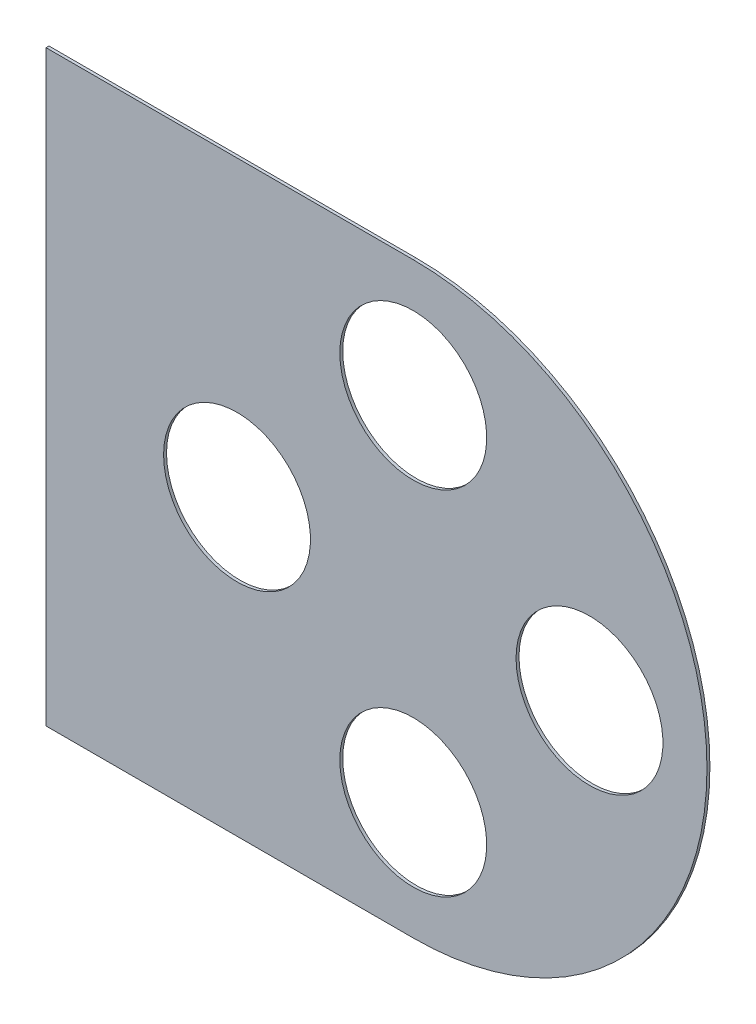
ISO-10303-21;
HEADER;
FILE_DESCRIPTION(('STEP AP214'),'2;1');
FILE_NAME('part.step','',(''),(''),'','','');
FILE_SCHEMA(('AUTOMOTIVE_DESIGN { 1 0 10303 214 1 1 1 1 }'));
ENDSEC;
DATA;
#1=APPLICATION_CONTEXT('core data for automotive mechanical design processes');
#2=APPLICATION_PROTOCOL_DEFINITION('international standard','automotive_design',2000,#1);
#3=PRODUCT_CONTEXT('',#1,'mechanical');
#4=PRODUCT('Part','Part','',(#3));
#5=PRODUCT_RELATED_PRODUCT_CATEGORY('part','',(#4));
#6=PRODUCT_DEFINITION_FORMATION('','',#4);
#7=PRODUCT_DEFINITION_CONTEXT('part definition',#1,'design');
#8=PRODUCT_DEFINITION('design','',#6,#7);
#9=PRODUCT_DEFINITION_SHAPE('','',#8);
#10=(LENGTH_UNIT() NAMED_UNIT(*) SI_UNIT(.MILLI.,.METRE.));
#11=(NAMED_UNIT(*) PLANE_ANGLE_UNIT() SI_UNIT($,.RADIAN.));
#12=(NAMED_UNIT(*) SI_UNIT($,.STERADIAN.) SOLID_ANGLE_UNIT());
#13=UNCERTAINTY_MEASURE_WITH_UNIT(LENGTH_MEASURE(1.E-05),#10,'distance_accuracy_value','');
#14=(GEOMETRIC_REPRESENTATION_CONTEXT(3) GLOBAL_UNCERTAINTY_ASSIGNED_CONTEXT((#13)) GLOBAL_UNIT_ASSIGNED_CONTEXT((#10,
#11,#12)) REPRESENTATION_CONTEXT('',''));
#15=CARTESIAN_POINT('',(0.,0.,0.));
#16=DIRECTION('',(0.,0.,1.));
#17=DIRECTION('',(1.,0.,0.));
#18=AXIS2_PLACEMENT_3D('',#15,#16,#17);
#19=CARTESIAN_POINT('',(-12.5,-10.,14.));
#20=DIRECTION('',(-1.,0.,0.));
#21=DIRECTION('',(0.,1.,0.));
#22=AXIS2_PLACEMENT_3D('',#19,#20,#21);
#23=PLANE('',#22);
#24=DIRECTION('',(0.,0.,-1.));
#25=VECTOR('',#24,1.);
#26=CARTESIAN_POINT('',(-12.5,-10.,14.));
#27=LINE('',#26,#25);
#28=CARTESIAN_POINT('',(-12.5,-10.,14.1));
#29=VERTEX_POINT('',#28);
#30=CARTESIAN_POINT('',(-12.5,-10.,14.));
#31=VERTEX_POINT('',#30);
#32=EDGE_CURVE('E11',#29,#31,#27,.T.);
#33=ORIENTED_EDGE('',*,*,#32,.F.);
#34=DIRECTION('',(0.,1.,0.));
#35=VECTOR('',#34,1.);
#36=CARTESIAN_POINT('',(-12.5,-10.,14.1));
#37=LINE('',#36,#35);
#38=CARTESIAN_POINT('',(-12.5,10.,14.1));
#39=VERTEX_POINT('',#38);
#40=EDGE_CURVE('E94',#29,#39,#37,.T.);
#41=ORIENTED_EDGE('',*,*,#40,.T.);
#42=DIRECTION('',(0.,0.,-1.));
#43=VECTOR('',#42,1.);
#44=CARTESIAN_POINT('',(-12.5,10.,14.));
#45=LINE('',#44,#43);
#46=CARTESIAN_POINT('',(-12.5,10.,14.));
#47=VERTEX_POINT('',#46);
#48=EDGE_CURVE('E47',#39,#47,#45,.T.);
#49=ORIENTED_EDGE('',*,*,#48,.T.);
#50=DIRECTION('',(0.,1.,0.));
#51=VECTOR('',#50,1.);
#52=CARTESIAN_POINT('',(-12.5,-10.,14.));
#53=LINE('',#52,#51);
#54=EDGE_CURVE('E119',#31,#47,#53,.T.);
#55=ORIENTED_EDGE('',*,*,#54,.F.);
#56=EDGE_LOOP('',(#33,#41,#49,#55));
#57=FACE_BOUND('',#56,.T.);
#58=ADVANCED_FACE('F37',(#57),#23,.T.);
#59=CARTESIAN_POINT('',(11.,10.,14.));
#60=DIRECTION('',(0.,-1.,0.));
#61=DIRECTION('',(-1.,0.,0.));
#62=AXIS2_PLACEMENT_3D('',#59,#60,#61);
#63=PLANE('',#62);
#64=ORIENTED_EDGE('',*,*,#48,.F.);
#65=DIRECTION('',(-1.,0.,0.));
#66=VECTOR('',#65,1.);
#67=CARTESIAN_POINT('',(11.,10.,14.1));
#68=LINE('',#67,#66);
#69=CARTESIAN_POINT('',(0.,10.,14.1));
#70=VERTEX_POINT('',#69);
#71=EDGE_CURVE('E101',#70,#39,#68,.T.);
#72=ORIENTED_EDGE('',*,*,#71,.F.);
#73=DIRECTION('',(0.,0.,-1.));
#74=VECTOR('',#73,1.);
#75=CARTESIAN_POINT('',(0.,10.,14.));
#76=LINE('',#75,#74);
#77=CARTESIAN_POINT('',(0.,10.,14.));
#78=VERTEX_POINT('',#77);
#79=EDGE_CURVE('E55',#70,#78,#76,.T.);
#80=ORIENTED_EDGE('',*,*,#79,.T.);
#81=DIRECTION('',(-1.,0.,0.));
#82=VECTOR('',#81,1.);
#83=CARTESIAN_POINT('',(11.,10.,14.));
#84=LINE('',#83,#82);
#85=EDGE_CURVE('E124',#78,#47,#84,.T.);
#86=ORIENTED_EDGE('',*,*,#85,.T.);
#87=EDGE_LOOP('',(#64,#72,#80,#86));
#88=FACE_BOUND('',#87,.T.);
#89=ADVANCED_FACE('F126',(#88),#63,.F.);
#90=CARTESIAN_POINT('',(0.,0.,14.));
#91=DIRECTION('',(0.,0.,-1.));
#92=DIRECTION('',(-1.,0.,0.));
#93=AXIS2_PLACEMENT_3D('',#90,#91,#92);
#94=CYLINDRICAL_SURFACE('',#93,10.);
#95=ORIENTED_EDGE('',*,*,#79,.F.);
#96=CARTESIAN_POINT('',(0.,0.,14.1));
#97=DIRECTION('',(0.,0.,-1.));
#98=DIRECTION('',(-1.,0.,0.));
#99=AXIS2_PLACEMENT_3D('',#96,#97,#98);
#100=CIRCLE('',#99,10.);
#101=CARTESIAN_POINT('',(0.,-10.,14.1));
#102=VERTEX_POINT('',#101);
#103=EDGE_CURVE('E93',#102,#70,#100,.F.);
#104=ORIENTED_EDGE('',*,*,#103,.F.);
#105=DIRECTION('',(0.,0.,-1.));
#106=VECTOR('',#105,1.);
#107=CARTESIAN_POINT('',(0.,-10.,14.));
#108=LINE('',#107,#106);
#109=CARTESIAN_POINT('',(0.,-10.,14.));
#110=VERTEX_POINT('',#109);
#111=EDGE_CURVE('E41',#102,#110,#108,.T.);
#112=ORIENTED_EDGE('',*,*,#111,.T.);
#113=CARTESIAN_POINT('',(0.,0.,14.));
#114=DIRECTION('',(0.,0.,-1.));
#115=DIRECTION('',(-1.,0.,0.));
#116=AXIS2_PLACEMENT_3D('',#113,#114,#115);
#117=CIRCLE('',#116,10.);
#118=EDGE_CURVE('E116',#110,#78,#117,.F.);
#119=ORIENTED_EDGE('',*,*,#118,.T.);
#120=EDGE_LOOP('',(#95,#104,#112,#119));
#121=FACE_BOUND('',#120,.T.);
#122=ADVANCED_FACE('F96',(#121),#94,.T.);
#123=CARTESIAN_POINT('',(11.,-10.,14.));
#124=DIRECTION('',(0.,-1.,0.));
#125=DIRECTION('',(-1.,0.,0.));
#126=AXIS2_PLACEMENT_3D('',#123,#124,#125);
#127=PLANE('',#126);
#128=DIRECTION('',(-1.,0.,0.));
#129=VECTOR('',#128,1.);
#130=CARTESIAN_POINT('',(11.,-10.,14.1));
#131=LINE('',#130,#129);
#132=EDGE_CURVE('E81',#102,#29,#131,.T.);
#133=ORIENTED_EDGE('',*,*,#132,.T.);
#134=ORIENTED_EDGE('',*,*,#32,.T.);
#135=DIRECTION('',(-1.,0.,0.));
#136=VECTOR('',#135,1.);
#137=CARTESIAN_POINT('',(11.,-10.,14.));
#138=LINE('',#137,#136);
#139=EDGE_CURVE('E83',#110,#31,#138,.T.);
#140=ORIENTED_EDGE('',*,*,#139,.F.);
#141=ORIENTED_EDGE('',*,*,#111,.F.);
#142=EDGE_LOOP('',(#133,#134,#140,#141));
#143=FACE_BOUND('',#142,.T.);
#144=ADVANCED_FACE('F80',(#143),#127,.T.);
#145=CARTESIAN_POINT('',(6.,0.,14.));
#146=DIRECTION('',(0.,0.,-1.));
#147=DIRECTION('',(-1.,0.,0.));
#148=AXIS2_PLACEMENT_3D('',#145,#146,#147);
#149=CYLINDRICAL_SURFACE('',#148,2.5);
#150=CARTESIAN_POINT('',(6.,0.,14.));
#151=DIRECTION('',(0.,0.,-1.));
#152=DIRECTION('',(-1.,0.,0.));
#153=AXIS2_PLACEMENT_3D('',#150,#151,#152);
#154=CIRCLE('',#153,2.5);
#155=CARTESIAN_POINT('',(3.5,0.,14.));
#156=VERTEX_POINT('',#155);
#157=EDGE_CURVE('E127',#156,#156,#154,.T.);
#158=ORIENTED_EDGE('',*,*,#157,.T.);
#159=EDGE_LOOP('',(#158));
#160=FACE_BOUND('',#159,.T.);
#161=CARTESIAN_POINT('',(6.,0.,14.1));
#162=DIRECTION('',(0.,0.,-1.));
#163=DIRECTION('',(-1.,0.,0.));
#164=AXIS2_PLACEMENT_3D('',#161,#162,#163);
#165=CIRCLE('',#164,2.5);
#166=CARTESIAN_POINT('',(3.5,0.,14.1));
#167=VERTEX_POINT('',#166);
#168=EDGE_CURVE('E103',#167,#167,#165,.T.);
#169=ORIENTED_EDGE('',*,*,#168,.F.);
#170=EDGE_LOOP('',(#169));
#171=FACE_BOUND('',#170,.T.);
#172=ADVANCED_FACE('F163',(#160,#171),#149,.F.);
#173=CARTESIAN_POINT('',(0.,-6.,14.));
#174=DIRECTION('',(0.,0.,-1.));
#175=DIRECTION('',(-1.,0.,0.));
#176=AXIS2_PLACEMENT_3D('',#173,#174,#175);
#177=CYLINDRICAL_SURFACE('',#176,2.5);
#178=CARTESIAN_POINT('',(0.,-6.,14.));
#179=DIRECTION('',(0.,0.,-1.));
#180=DIRECTION('',(-1.,0.,0.));
#181=AXIS2_PLACEMENT_3D('',#178,#179,#180);
#182=CIRCLE('',#181,2.5);
#183=CARTESIAN_POINT('',(-2.5,-6.,14.));
#184=VERTEX_POINT('',#183);
#185=EDGE_CURVE('E130',#184,#184,#182,.T.);
#186=ORIENTED_EDGE('',*,*,#185,.T.);
#187=EDGE_LOOP('',(#186));
#188=FACE_BOUND('',#187,.T.);
#189=CARTESIAN_POINT('',(0.,-6.,14.1));
#190=DIRECTION('',(0.,0.,-1.));
#191=DIRECTION('',(-1.,0.,0.));
#192=AXIS2_PLACEMENT_3D('',#189,#190,#191);
#193=CIRCLE('',#192,2.5);
#194=CARTESIAN_POINT('',(-2.5,-6.,14.1));
#195=VERTEX_POINT('',#194);
#196=EDGE_CURVE('E107',#195,#195,#193,.T.);
#197=ORIENTED_EDGE('',*,*,#196,.F.);
#198=EDGE_LOOP('',(#197));
#199=FACE_BOUND('',#198,.T.);
#200=ADVANCED_FACE('F166',(#188,#199),#177,.F.);
#201=CARTESIAN_POINT('',(-6.,0.,14.));
#202=DIRECTION('',(0.,0.,-1.));
#203=DIRECTION('',(-1.,0.,0.));
#204=AXIS2_PLACEMENT_3D('',#201,#202,#203);
#205=CYLINDRICAL_SURFACE('',#204,2.5);
#206=CARTESIAN_POINT('',(-6.,0.,14.));
#207=DIRECTION('',(0.,0.,-1.));
#208=DIRECTION('',(-1.,0.,0.));
#209=AXIS2_PLACEMENT_3D('',#206,#207,#208);
#210=CIRCLE('',#209,2.5);
#211=CARTESIAN_POINT('',(-8.5,0.,14.));
#212=VERTEX_POINT('',#211);
#213=EDGE_CURVE('E136',#212,#212,#210,.T.);
#214=ORIENTED_EDGE('',*,*,#213,.T.);
#215=EDGE_LOOP('',(#214));
#216=FACE_BOUND('',#215,.T.);
#217=CARTESIAN_POINT('',(-6.,0.,14.1));
#218=DIRECTION('',(0.,0.,-1.));
#219=DIRECTION('',(-1.,0.,0.));
#220=AXIS2_PLACEMENT_3D('',#217,#218,#219);
#221=CIRCLE('',#220,2.5);
#222=CARTESIAN_POINT('',(-8.5,0.,14.1));
#223=VERTEX_POINT('',#222);
#224=EDGE_CURVE('E110',#223,#223,#221,.T.);
#225=ORIENTED_EDGE('',*,*,#224,.F.);
#226=EDGE_LOOP('',(#225));
#227=FACE_BOUND('',#226,.T.);
#228=ADVANCED_FACE('F152',(#216,#227),#205,.F.);
#229=CARTESIAN_POINT('',(0.,6.,14.));
#230=DIRECTION('',(0.,0.,-1.));
#231=DIRECTION('',(-1.,0.,0.));
#232=AXIS2_PLACEMENT_3D('',#229,#230,#231);
#233=CYLINDRICAL_SURFACE('',#232,2.5);
#234=CARTESIAN_POINT('',(0.,6.,14.));
#235=DIRECTION('',(0.,0.,-1.));
#236=DIRECTION('',(-1.,0.,0.));
#237=AXIS2_PLACEMENT_3D('',#234,#235,#236);
#238=CIRCLE('',#237,2.5);
#239=CARTESIAN_POINT('',(-2.5,6.,14.));
#240=VERTEX_POINT('',#239);
#241=EDGE_CURVE('E87',#240,#240,#238,.T.);
#242=ORIENTED_EDGE('',*,*,#241,.T.);
#243=EDGE_LOOP('',(#242));
#244=FACE_BOUND('',#243,.T.);
#245=CARTESIAN_POINT('',(0.,6.,14.1));
#246=DIRECTION('',(0.,0.,-1.));
#247=DIRECTION('',(-1.,0.,0.));
#248=AXIS2_PLACEMENT_3D('',#245,#246,#247);
#249=CIRCLE('',#248,2.5);
#250=CARTESIAN_POINT('',(-2.5,6.,14.1));
#251=VERTEX_POINT('',#250);
#252=EDGE_CURVE('E113',#251,#251,#249,.T.);
#253=ORIENTED_EDGE('',*,*,#252,.F.);
#254=EDGE_LOOP('',(#253));
#255=FACE_BOUND('',#254,.T.);
#256=ADVANCED_FACE('F39',(#244,#255),#233,.F.);
#257=CARTESIAN_POINT('',(11.,-10.,14.));
#258=DIRECTION('',(0.,0.,-1.));
#259=DIRECTION('',(-1.,0.,0.));
#260=AXIS2_PLACEMENT_3D('',#257,#258,#259);
#261=PLANE('',#260);
#262=ORIENTED_EDGE('',*,*,#118,.F.);
#263=ORIENTED_EDGE('',*,*,#139,.T.);
#264=ORIENTED_EDGE('',*,*,#54,.T.);
#265=ORIENTED_EDGE('',*,*,#85,.F.);
#266=EDGE_LOOP('',(#262,#263,#264,#265));
#267=FACE_BOUND('',#266,.T.);
#268=ORIENTED_EDGE('',*,*,#157,.F.);
#269=EDGE_LOOP('',(#268));
#270=FACE_BOUND('',#269,.T.);
#271=ORIENTED_EDGE('',*,*,#185,.F.);
#272=EDGE_LOOP('',(#271));
#273=FACE_BOUND('',#272,.T.);
#274=ORIENTED_EDGE('',*,*,#213,.F.);
#275=EDGE_LOOP('',(#274));
#276=FACE_BOUND('',#275,.T.);
#277=ORIENTED_EDGE('',*,*,#241,.F.);
#278=EDGE_LOOP('',(#277));
#279=FACE_BOUND('',#278,.T.);
#280=ADVANCED_FACE('F122',(#267,#270,#273,#276,#279),#261,.T.);
#281=CARTESIAN_POINT('',(11.,-10.,14.1));
#282=DIRECTION('',(0.,0.,-1.));
#283=DIRECTION('',(-1.,0.,0.));
#284=AXIS2_PLACEMENT_3D('',#281,#282,#283);
#285=PLANE('',#284);
#286=ORIENTED_EDGE('',*,*,#103,.T.);
#287=ORIENTED_EDGE('',*,*,#71,.T.);
#288=ORIENTED_EDGE('',*,*,#40,.F.);
#289=ORIENTED_EDGE('',*,*,#132,.F.);
#290=EDGE_LOOP('',(#286,#287,#288,#289));
#291=FACE_BOUND('',#290,.T.);
#292=ORIENTED_EDGE('',*,*,#168,.T.);
#293=EDGE_LOOP('',(#292));
#294=FACE_BOUND('',#293,.T.);
#295=ORIENTED_EDGE('',*,*,#196,.T.);
#296=EDGE_LOOP('',(#295));
#297=FACE_BOUND('',#296,.T.);
#298=ORIENTED_EDGE('',*,*,#224,.T.);
#299=EDGE_LOOP('',(#298));
#300=FACE_BOUND('',#299,.T.);
#301=ORIENTED_EDGE('',*,*,#252,.T.);
#302=EDGE_LOOP('',(#301));
#303=FACE_BOUND('',#302,.T.);
#304=ADVANCED_FACE('F90',(#291,#294,#297,#300,#303),#285,.F.);
#305=CLOSED_SHELL('',(#58,#89,#122,#144,#172,#200,#228,#256,#280,#304));
#306=MANIFOLD_SOLID_BREP('B2',#305);
#307=ADVANCED_BREP_SHAPE_REPRESENTATION('',(#18,#306),#14);
#308=SHAPE_DEFINITION_REPRESENTATION(#9,#307);
ENDSEC;
END-ISO-10303-21;
